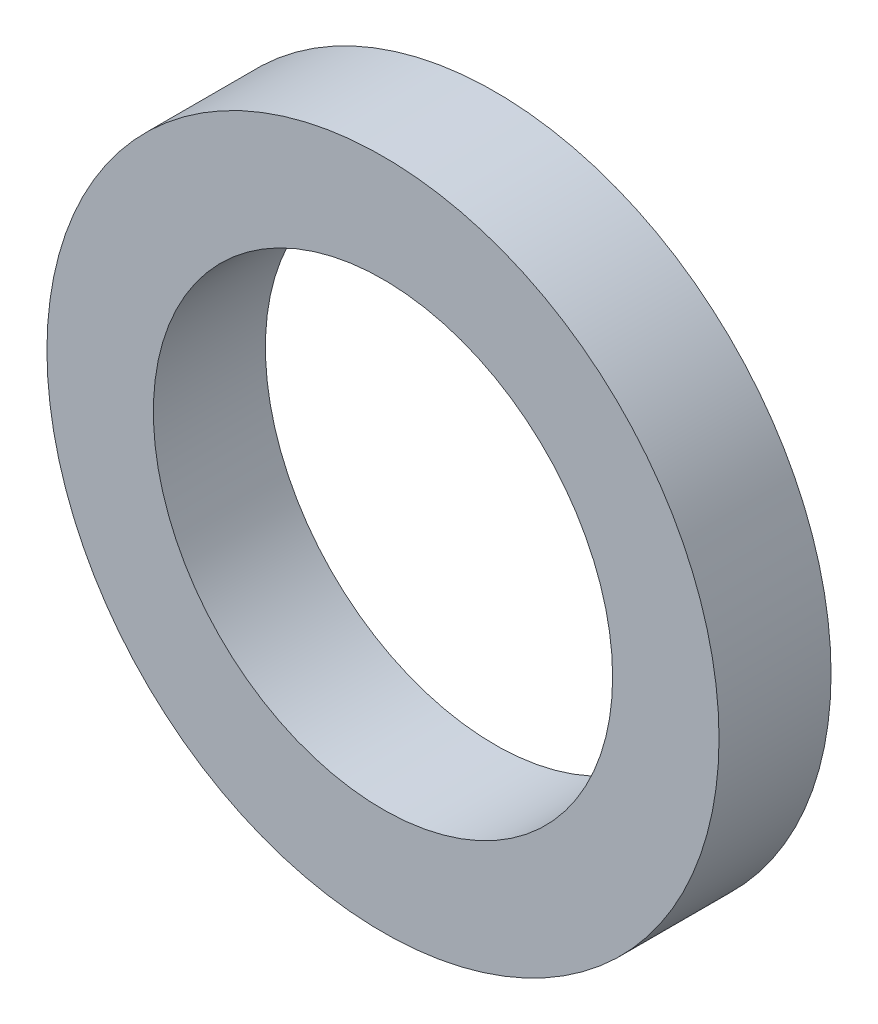
ISO-10303-21;
HEADER;
FILE_DESCRIPTION(('STEP AP214'),'2;1');
FILE_NAME('part.step','',(''),(''),'','','');
FILE_SCHEMA(('AUTOMOTIVE_DESIGN { 1 0 10303 214 1 1 1 1 }'));
ENDSEC;
DATA;
#1=APPLICATION_CONTEXT('core data for automotive mechanical design processes');
#2=APPLICATION_PROTOCOL_DEFINITION('international standard','automotive_design',2000,#1);
#3=PRODUCT_CONTEXT('',#1,'mechanical');
#4=PRODUCT('Part','Part','',(#3));
#5=PRODUCT_RELATED_PRODUCT_CATEGORY('part','',(#4));
#6=PRODUCT_DEFINITION_FORMATION('','',#4);
#7=PRODUCT_DEFINITION_CONTEXT('part definition',#1,'design');
#8=PRODUCT_DEFINITION('design','',#6,#7);
#9=PRODUCT_DEFINITION_SHAPE('','',#8);
#10=(LENGTH_UNIT() NAMED_UNIT(*) SI_UNIT(.MILLI.,.METRE.));
#11=(NAMED_UNIT(*) PLANE_ANGLE_UNIT() SI_UNIT($,.RADIAN.));
#12=(NAMED_UNIT(*) SI_UNIT($,.STERADIAN.) SOLID_ANGLE_UNIT());
#13=UNCERTAINTY_MEASURE_WITH_UNIT(LENGTH_MEASURE(1.E-05),#10,'distance_accuracy_value','');
#14=(GEOMETRIC_REPRESENTATION_CONTEXT(3) GLOBAL_UNCERTAINTY_ASSIGNED_CONTEXT((#13)) GLOBAL_UNIT_ASSIGNED_CONTEXT((#10,
#11,#12)) REPRESENTATION_CONTEXT('',''));
#15=CARTESIAN_POINT('',(0.,0.,0.));
#16=DIRECTION('',(0.,0.,1.));
#17=DIRECTION('',(1.,0.,0.));
#18=AXIS2_PLACEMENT_3D('',#15,#16,#17);
#19=CARTESIAN_POINT('',(0.,0.,2.));
#20=DIRECTION('',(0.,0.,1.));
#21=DIRECTION('',(1.,0.,0.));
#22=AXIS2_PLACEMENT_3D('',#19,#20,#21);
#23=PLANE('',#22);
#24=CARTESIAN_POINT('',(0.,0.,2.));
#25=DIRECTION('',(0.,0.,1.));
#26=DIRECTION('',(1.,0.,0.));
#27=AXIS2_PLACEMENT_3D('',#24,#25,#26);
#28=CIRCLE('',#27,6.);
#29=CARTESIAN_POINT('',(6.,0.,2.));
#30=VERTEX_POINT('',#29);
#31=EDGE_CURVE('E10',#30,#30,#28,.T.);
#32=ORIENTED_EDGE('',*,*,#31,.T.);
#33=EDGE_LOOP('',(#32));
#34=FACE_BOUND('',#33,.T.);
#35=CARTESIAN_POINT('',(0.,0.,2.));
#36=DIRECTION('',(0.,0.,1.));
#37=DIRECTION('',(1.,0.,0.));
#38=AXIS2_PLACEMENT_3D('',#35,#36,#37);
#39=CIRCLE('',#38,4.1);
#40=CARTESIAN_POINT('',(4.1,0.,2.));
#41=VERTEX_POINT('',#40);
#42=EDGE_CURVE('E44',#41,#41,#39,.T.);
#43=ORIENTED_EDGE('',*,*,#42,.F.);
#44=EDGE_LOOP('',(#43));
#45=FACE_BOUND('',#44,.T.);
#46=ADVANCED_FACE('F33',(#34,#45),#23,.T.);
#47=CARTESIAN_POINT('',(0.,0.,0.));
#48=DIRECTION('',(0.,0.,1.));
#49=DIRECTION('',(1.,0.,0.));
#50=AXIS2_PLACEMENT_3D('',#47,#48,#49);
#51=PLANE('',#50);
#52=CARTESIAN_POINT('',(0.,0.,0.));
#53=DIRECTION('',(0.,0.,1.));
#54=DIRECTION('',(1.,0.,0.));
#55=AXIS2_PLACEMENT_3D('',#52,#53,#54);
#56=CIRCLE('',#55,6.);
#57=CARTESIAN_POINT('',(6.,0.,0.));
#58=VERTEX_POINT('',#57);
#59=EDGE_CURVE('E37',#58,#58,#56,.T.);
#60=ORIENTED_EDGE('',*,*,#59,.F.);
#61=EDGE_LOOP('',(#60));
#62=FACE_BOUND('',#61,.T.);
#63=CARTESIAN_POINT('',(0.,0.,0.));
#64=DIRECTION('',(0.,0.,1.));
#65=DIRECTION('',(1.,0.,0.));
#66=AXIS2_PLACEMENT_3D('',#63,#64,#65);
#67=CIRCLE('',#66,4.1);
#68=CARTESIAN_POINT('',(4.1,0.,0.));
#69=VERTEX_POINT('',#68);
#70=EDGE_CURVE('E46',#69,#69,#67,.T.);
#71=ORIENTED_EDGE('',*,*,#70,.T.);
#72=EDGE_LOOP('',(#71));
#73=FACE_BOUND('',#72,.T.);
#74=ADVANCED_FACE('F56',(#62,#73),#51,.F.);
#75=CARTESIAN_POINT('',(0.,0.,2.));
#76=DIRECTION('',(0.,0.,-1.));
#77=DIRECTION('',(-1.,0.,0.));
#78=AXIS2_PLACEMENT_3D('',#75,#76,#77);
#79=CYLINDRICAL_SURFACE('',#78,6.);
#80=ORIENTED_EDGE('',*,*,#31,.F.);
#81=EDGE_LOOP('',(#80));
#82=FACE_BOUND('',#81,.T.);
#83=ORIENTED_EDGE('',*,*,#59,.T.);
#84=EDGE_LOOP('',(#83));
#85=FACE_BOUND('',#84,.T.);
#86=ADVANCED_FACE('F35',(#82,#85),#79,.T.);
#87=CARTESIAN_POINT('',(0.,0.,2.));
#88=DIRECTION('',(0.,0.,-1.));
#89=DIRECTION('',(-1.,0.,0.));
#90=AXIS2_PLACEMENT_3D('',#87,#88,#89);
#91=CYLINDRICAL_SURFACE('',#90,4.1);
#92=ORIENTED_EDGE('',*,*,#42,.T.);
#93=EDGE_LOOP('',(#92));
#94=FACE_BOUND('',#93,.T.);
#95=ORIENTED_EDGE('',*,*,#70,.F.);
#96=EDGE_LOOP('',(#95));
#97=FACE_BOUND('',#96,.T.);
#98=ADVANCED_FACE('F52',(#94,#97),#91,.F.);
#99=CLOSED_SHELL('',(#46,#74,#86,#98));
#100=MANIFOLD_SOLID_BREP('B2',#99);
#101=ADVANCED_BREP_SHAPE_REPRESENTATION('',(#18,#100),#14);
#102=SHAPE_DEFINITION_REPRESENTATION(#9,#101);
ENDSEC;
END-ISO-10303-21;
